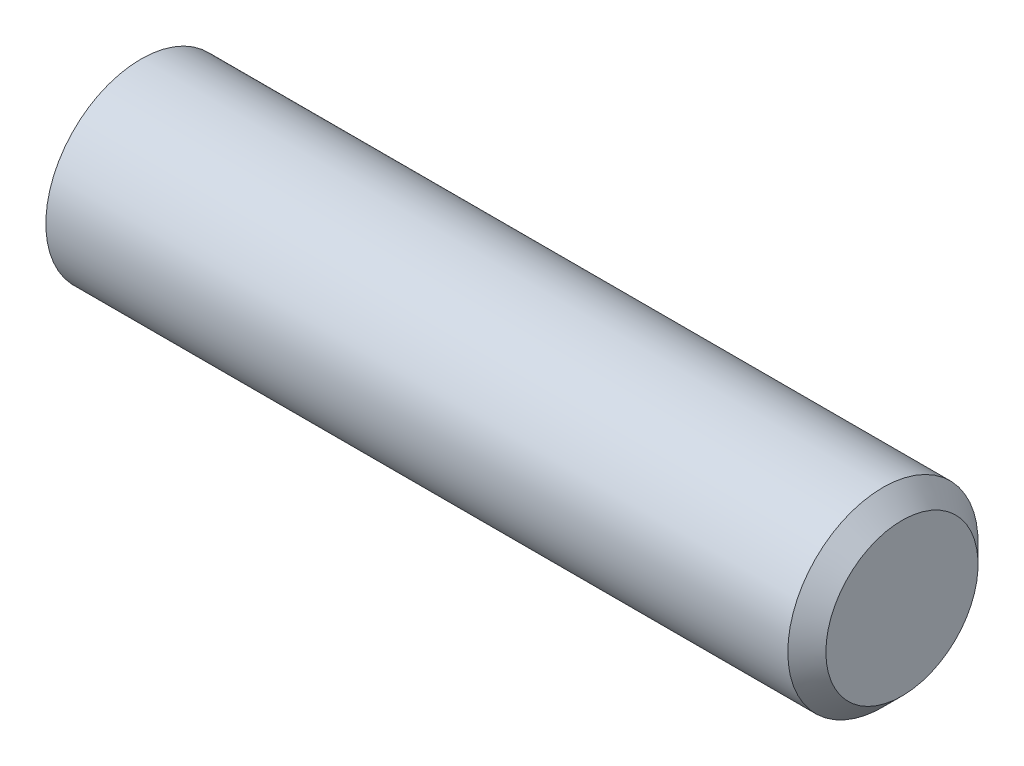
ISO-10303-21;
HEADER;
FILE_DESCRIPTION(('STEP AP214'),'2;1');
FILE_NAME('part.step','',(''),(''),'','','');
FILE_SCHEMA(('AUTOMOTIVE_DESIGN { 1 0 10303 214 1 1 1 1 }'));
ENDSEC;
DATA;
#1=APPLICATION_CONTEXT('core data for automotive mechanical design processes');
#2=APPLICATION_PROTOCOL_DEFINITION('international standard','automotive_design',2000,#1);
#3=PRODUCT_CONTEXT('',#1,'mechanical');
#4=PRODUCT('Part','Part','',(#3));
#5=PRODUCT_RELATED_PRODUCT_CATEGORY('part','',(#4));
#6=PRODUCT_DEFINITION_FORMATION('','',#4);
#7=PRODUCT_DEFINITION_CONTEXT('part definition',#1,'design');
#8=PRODUCT_DEFINITION('design','',#6,#7);
#9=PRODUCT_DEFINITION_SHAPE('','',#8);
#10=(LENGTH_UNIT() NAMED_UNIT(*) SI_UNIT(.MILLI.,.METRE.));
#11=(NAMED_UNIT(*) PLANE_ANGLE_UNIT() SI_UNIT($,.RADIAN.));
#12=(NAMED_UNIT(*) SI_UNIT($,.STERADIAN.) SOLID_ANGLE_UNIT());
#13=UNCERTAINTY_MEASURE_WITH_UNIT(LENGTH_MEASURE(1.E-05),#10,'distance_accuracy_value','');
#14=(GEOMETRIC_REPRESENTATION_CONTEXT(3) GLOBAL_UNCERTAINTY_ASSIGNED_CONTEXT((#13)) GLOBAL_UNIT_ASSIGNED_CONTEXT((#10,
#11,#12)) REPRESENTATION_CONTEXT('',''));
#15=CARTESIAN_POINT('',(0.,0.,0.));
#16=DIRECTION('',(0.,0.,1.));
#17=DIRECTION('',(1.,0.,0.));
#18=AXIS2_PLACEMENT_3D('',#15,#16,#17);
#19=CARTESIAN_POINT('',(0.,1.,0.));
#20=DIRECTION('',(1.,0.,0.));
#21=DIRECTION('',(0.,0.,-1.));
#22=AXIS2_PLACEMENT_3D('',#19,#20,#21);
#23=PLANE('',#22);
#24=CARTESIAN_POINT('',(2.27373675443232E-10,0.,0.));
#25=DIRECTION('',(-1.,0.,0.));
#26=DIRECTION('',(0.,0.,1.));
#27=AXIS2_PLACEMENT_3D('',#24,#25,#26);
#28=CIRCLE('',#27,2.00000000023692);
#29=CARTESIAN_POINT('',(2.27373675443232E-10,0.,2.00000000023692));
#30=VERTEX_POINT('',#29);
#31=EDGE_CURVE('E18',#30,#30,#28,.T.);
#32=ORIENTED_EDGE('',*,*,#31,.F.);
#33=EDGE_LOOP('',(#32));
#34=FACE_BOUND('',#33,.T.);
#35=ADVANCED_FACE('F15',(#34),#23,.T.);
#36=CARTESIAN_POINT('',(-0.50000000021555,0.,0.));
#37=DIRECTION('',(-1.,0.,0.));
#38=DIRECTION('',(0.,0.,1.));
#39=AXIS2_PLACEMENT_3D('',#36,#37,#38);
#40=CONICAL_SURFACE('',#39,2.4999999998272,0.785398162544797);
#41=CARTESIAN_POINT('',(-0.5,0.,0.));
#42=DIRECTION('',(1.,0.,0.));
#43=DIRECTION('',(0.,1.,0.));
#44=AXIS2_PLACEMENT_3D('',#41,#42,#43);
#45=CIRCLE('',#44,2.5);
#46=CARTESIAN_POINT('',(-0.5,2.5,0.));
#47=VERTEX_POINT('',#46);
#48=EDGE_CURVE('E22',#47,#47,#45,.F.);
#49=ORIENTED_EDGE('',*,*,#48,.F.);
#50=EDGE_LOOP('',(#49));
#51=FACE_BOUND('',#50,.T.);
#52=ORIENTED_EDGE('',*,*,#31,.T.);
#53=EDGE_LOOP('',(#52));
#54=FACE_BOUND('',#53,.T.);
#55=ADVANCED_FACE('F34',(#51,#54),#40,.T.);
#56=CARTESIAN_POINT('',(-20.,1.25,0.));
#57=DIRECTION('',(-1.,0.,0.));
#58=DIRECTION('',(0.,0.,1.));
#59=AXIS2_PLACEMENT_3D('',#56,#57,#58);
#60=PLANE('',#59);
#61=CARTESIAN_POINT('',(-20.,0.,0.));
#62=DIRECTION('',(1.,0.,0.));
#63=DIRECTION('',(0.,1.,0.));
#64=AXIS2_PLACEMENT_3D('',#61,#62,#63);
#65=CIRCLE('',#64,2.5);
#66=CARTESIAN_POINT('',(-20.,2.5,0.));
#67=VERTEX_POINT('',#66);
#68=EDGE_CURVE('E10',#67,#67,#65,.T.);
#69=ORIENTED_EDGE('',*,*,#68,.F.);
#70=EDGE_LOOP('',(#69));
#71=FACE_BOUND('',#70,.T.);
#72=ADVANCED_FACE('F41',(#71),#60,.T.);
#73=CARTESIAN_POINT('',(-10.25,0.,0.));
#74=DIRECTION('',(1.,0.,0.));
#75=DIRECTION('',(0.,1.,0.));
#76=AXIS2_PLACEMENT_3D('',#73,#74,#75);
#77=CYLINDRICAL_SURFACE('',#76,2.5);
#78=ORIENTED_EDGE('',*,*,#68,.T.);
#79=EDGE_LOOP('',(#78));
#80=FACE_BOUND('',#79,.T.);
#81=ORIENTED_EDGE('',*,*,#48,.T.);
#82=EDGE_LOOP('',(#81));
#83=FACE_BOUND('',#82,.T.);
#84=ADVANCED_FACE('F43',(#80,#83),#77,.T.);
#85=CLOSED_SHELL('',(#35,#55,#72,#84));
#86=MANIFOLD_SOLID_BREP('B1',#85);
#87=ADVANCED_BREP_SHAPE_REPRESENTATION('',(#18,#86),#14);
#88=SHAPE_DEFINITION_REPRESENTATION(#9,#87);
ENDSEC;
END-ISO-10303-21;
